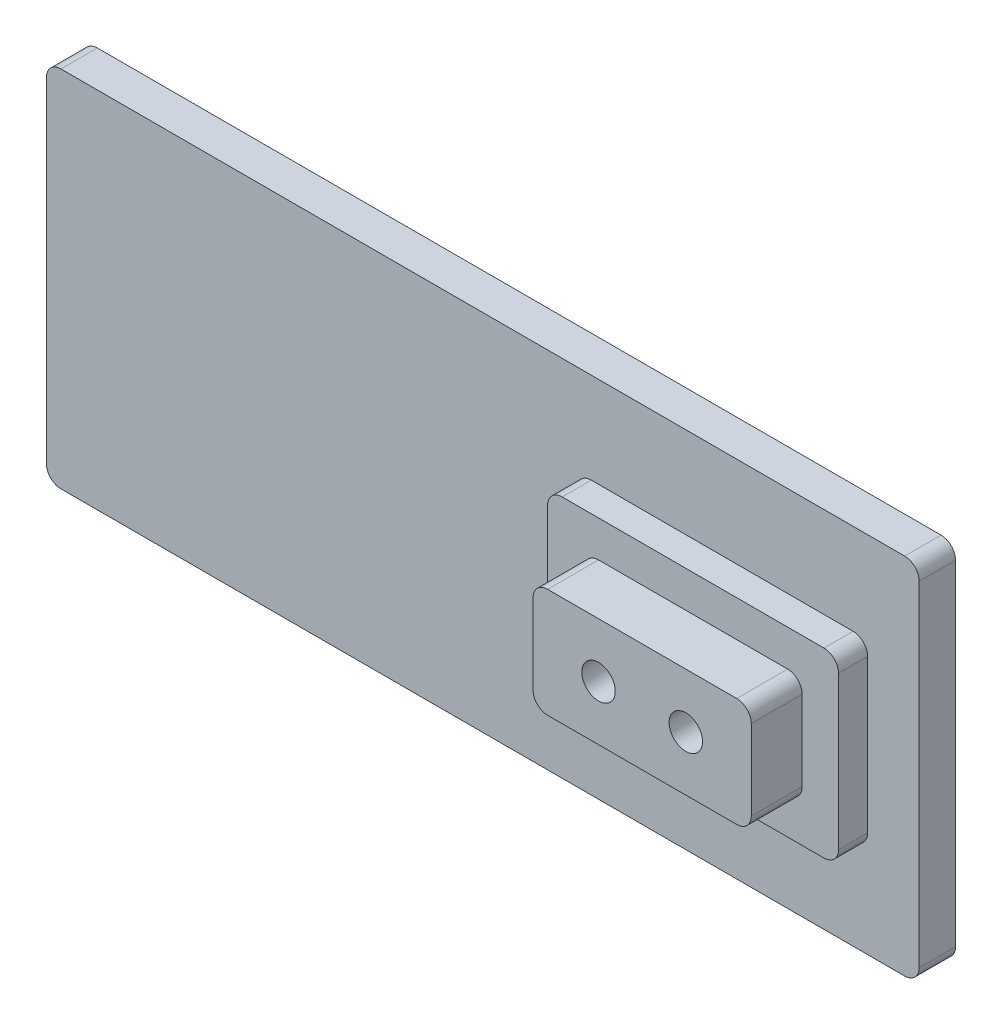
ISO-10303-21;
HEADER;
FILE_DESCRIPTION(('STEP AP214'),'2;1');
FILE_NAME('part.step','',(''),(''),'','','');
FILE_SCHEMA(('AUTOMOTIVE_DESIGN { 1 0 10303 214 1 1 1 1 }'));
ENDSEC;
DATA;
#1=APPLICATION_CONTEXT('core data for automotive mechanical design processes');
#2=APPLICATION_PROTOCOL_DEFINITION('international standard','automotive_design',2000,#1);
#3=PRODUCT_CONTEXT('',#1,'mechanical');
#4=PRODUCT('Part','Part','',(#3));
#5=PRODUCT_RELATED_PRODUCT_CATEGORY('part','',(#4));
#6=PRODUCT_DEFINITION_FORMATION('','',#4);
#7=PRODUCT_DEFINITION_CONTEXT('part definition',#1,'design');
#8=PRODUCT_DEFINITION('design','',#6,#7);
#9=PRODUCT_DEFINITION_SHAPE('','',#8);
#10=(LENGTH_UNIT() NAMED_UNIT(*) SI_UNIT(.MILLI.,.METRE.));
#11=(NAMED_UNIT(*) PLANE_ANGLE_UNIT() SI_UNIT($,.RADIAN.));
#12=(NAMED_UNIT(*) SI_UNIT($,.STERADIAN.) SOLID_ANGLE_UNIT());
#13=UNCERTAINTY_MEASURE_WITH_UNIT(LENGTH_MEASURE(1.E-05),#10,'distance_accuracy_value','');
#14=(GEOMETRIC_REPRESENTATION_CONTEXT(3) GLOBAL_UNCERTAINTY_ASSIGNED_CONTEXT((#13)) GLOBAL_UNIT_ASSIGNED_CONTEXT((#10,
#11,#12)) REPRESENTATION_CONTEXT('',''));
#15=CARTESIAN_POINT('',(0.,0.,0.));
#16=DIRECTION('',(0.,0.,1.));
#17=DIRECTION('',(1.,0.,0.));
#18=AXIS2_PLACEMENT_3D('',#15,#16,#17);
#19=CARTESIAN_POINT('',(-6.,0.,16.));
#20=DIRECTION('',(0.,0.,-1.));
#21=DIRECTION('',(-1.,0.,0.));
#22=AXIS2_PLACEMENT_3D('',#19,#20,#21);
#23=CYLINDRICAL_SURFACE('',#22,2.3);
#24=CARTESIAN_POINT('',(-6.,0.,16.));
#25=DIRECTION('',(0.,0.,1.));
#26=DIRECTION('',(-1.,0.,0.));
#27=AXIS2_PLACEMENT_3D('',#24,#25,#26);
#28=CIRCLE('',#27,2.3);
#29=CARTESIAN_POINT('',(-8.3,0.,16.));
#30=VERTEX_POINT('',#29);
#31=EDGE_CURVE('E333',#30,#30,#28,.T.);
#32=ORIENTED_EDGE('',*,*,#31,.T.);
#33=EDGE_LOOP('',(#32));
#34=FACE_BOUND('',#33,.T.);
#35=CARTESIAN_POINT('',(-6.,0.,5.));
#36=DIRECTION('',(0.,0.,-1.));
#37=DIRECTION('',(-1.,0.,0.));
#38=AXIS2_PLACEMENT_3D('',#35,#36,#37);
#39=CIRCLE('',#38,2.3);
#40=CARTESIAN_POINT('',(-8.3,0.,5.));
#41=VERTEX_POINT('',#40);
#42=EDGE_CURVE('E268',#41,#41,#39,.T.);
#43=ORIENTED_EDGE('',*,*,#42,.T.);
#44=EDGE_LOOP('',(#43));
#45=FACE_BOUND('',#44,.T.);
#46=ADVANCED_FACE('F39',(#34,#45),#23,.F.);
#47=CARTESIAN_POINT('',(6.,0.,16.));
#48=DIRECTION('',(0.,0.,-1.));
#49=DIRECTION('',(-1.,0.,0.));
#50=AXIS2_PLACEMENT_3D('',#47,#48,#49);
#51=CYLINDRICAL_SURFACE('',#50,2.3);
#52=CARTESIAN_POINT('',(6.,0.,16.));
#53=DIRECTION('',(0.,0.,1.));
#54=DIRECTION('',(1.,0.,0.));
#55=AXIS2_PLACEMENT_3D('',#52,#53,#54);
#56=CIRCLE('',#55,2.3);
#57=CARTESIAN_POINT('',(8.3,0.,16.));
#58=VERTEX_POINT('',#57);
#59=EDGE_CURVE('E320',#58,#58,#56,.T.);
#60=ORIENTED_EDGE('',*,*,#59,.T.);
#61=EDGE_LOOP('',(#60));
#62=FACE_BOUND('',#61,.T.);
#63=CARTESIAN_POINT('',(6.,0.,5.));
#64=DIRECTION('',(0.,0.,-1.));
#65=DIRECTION('',(-1.,0.,0.));
#66=AXIS2_PLACEMENT_3D('',#63,#64,#65);
#67=CIRCLE('',#66,2.3);
#68=CARTESIAN_POINT('',(3.7,0.,5.));
#69=VERTEX_POINT('',#68);
#70=EDGE_CURVE('E264',#69,#69,#67,.T.);
#71=ORIENTED_EDGE('',*,*,#70,.T.);
#72=EDGE_LOOP('',(#71));
#73=FACE_BOUND('',#72,.T.);
#74=ADVANCED_FACE('F502',(#62,#73),#51,.F.);
#75=CARTESIAN_POINT('',(15.,-7.5,16.));
#76=DIRECTION('',(-1.,0.,0.));
#77=DIRECTION('',(0.,0.,1.));
#78=AXIS2_PLACEMENT_3D('',#75,#76,#77);
#79=PLANE('',#78);
#80=DIRECTION('',(0.,1.,0.));
#81=VECTOR('',#80,1.);
#82=CARTESIAN_POINT('',(15.,-7.5,16.));
#83=LINE('',#82,#81);
#84=CARTESIAN_POINT('',(15.,-5.5,16.));
#85=VERTEX_POINT('',#84);
#86=CARTESIAN_POINT('',(15.,5.5,16.));
#87=VERTEX_POINT('',#86);
#88=EDGE_CURVE('E336',#85,#87,#83,.T.);
#89=ORIENTED_EDGE('',*,*,#88,.F.);
#90=DIRECTION('',(0.,0.,-1.));
#91=VECTOR('',#90,1.);
#92=CARTESIAN_POINT('',(15.,-5.5,16.));
#93=LINE('',#92,#91);
#94=CARTESIAN_POINT('',(15.,-5.5,9.));
#95=VERTEX_POINT('',#94);
#96=EDGE_CURVE('E352',#85,#95,#93,.T.);
#97=ORIENTED_EDGE('',*,*,#96,.T.);
#98=DIRECTION('',(0.,1.,0.));
#99=VECTOR('',#98,1.);
#100=CARTESIAN_POINT('',(15.,-7.5,9.));
#101=LINE('',#100,#99);
#102=CARTESIAN_POINT('',(15.,5.49999999999999,9.));
#103=VERTEX_POINT('',#102);
#104=EDGE_CURVE('E271',#95,#103,#101,.T.);
#105=ORIENTED_EDGE('',*,*,#104,.T.);
#106=DIRECTION('',(0.,0.,-1.));
#107=VECTOR('',#106,1.);
#108=CARTESIAN_POINT('',(15.,5.5,16.));
#109=LINE('',#108,#107);
#110=EDGE_CURVE('E348',#103,#87,#109,.F.);
#111=ORIENTED_EDGE('',*,*,#110,.T.);
#112=EDGE_LOOP('',(#89,#97,#105,#111));
#113=FACE_BOUND('',#112,.T.);
#114=ADVANCED_FACE('F508',(#113),#79,.F.);
#115=CARTESIAN_POINT('',(-15.,7.5,16.));
#116=DIRECTION('',(0.,-1.,0.));
#117=DIRECTION('',(0.,0.,-1.));
#118=AXIS2_PLACEMENT_3D('',#115,#116,#117);
#119=PLANE('',#118);
#120=DIRECTION('',(-1.,0.,0.));
#121=VECTOR('',#120,1.);
#122=CARTESIAN_POINT('',(-15.,7.5,16.));
#123=LINE('',#122,#121);
#124=CARTESIAN_POINT('',(13.,7.5,16.));
#125=VERTEX_POINT('',#124);
#126=CARTESIAN_POINT('',(-13.,7.5,16.));
#127=VERTEX_POINT('',#126);
#128=EDGE_CURVE('E339',#125,#127,#123,.T.);
#129=ORIENTED_EDGE('',*,*,#128,.F.);
#130=DIRECTION('',(0.,0.,-1.));
#131=VECTOR('',#130,1.);
#132=CARTESIAN_POINT('',(13.,7.5,16.));
#133=LINE('',#132,#131);
#134=CARTESIAN_POINT('',(13.,7.5,9.));
#135=VERTEX_POINT('',#134);
#136=EDGE_CURVE('E370',#125,#135,#133,.T.);
#137=ORIENTED_EDGE('',*,*,#136,.T.);
#138=DIRECTION('',(-1.,0.,0.));
#139=VECTOR('',#138,1.);
#140=CARTESIAN_POINT('',(-15.,7.5,9.));
#141=LINE('',#140,#139);
#142=CARTESIAN_POINT('',(-13.,7.5,9.));
#143=VERTEX_POINT('',#142);
#144=EDGE_CURVE('E274',#135,#143,#141,.T.);
#145=ORIENTED_EDGE('',*,*,#144,.T.);
#146=DIRECTION('',(0.,0.,-1.));
#147=VECTOR('',#146,1.);
#148=CARTESIAN_POINT('',(-13.,7.5,16.));
#149=LINE('',#148,#147);
#150=EDGE_CURVE('E368',#143,#127,#149,.F.);
#151=ORIENTED_EDGE('',*,*,#150,.T.);
#152=EDGE_LOOP('',(#129,#137,#145,#151));
#153=FACE_BOUND('',#152,.T.);
#154=ADVANCED_FACE('F530',(#153),#119,.F.);
#155=CARTESIAN_POINT('',(-15.,-7.5,16.));
#156=DIRECTION('',(1.,0.,0.));
#157=DIRECTION('',(0.,0.,-1.));
#158=AXIS2_PLACEMENT_3D('',#155,#156,#157);
#159=PLANE('',#158);
#160=DIRECTION('',(0.,-1.,0.));
#161=VECTOR('',#160,1.);
#162=CARTESIAN_POINT('',(-15.,-7.5,16.));
#163=LINE('',#162,#161);
#164=CARTESIAN_POINT('',(-15.,5.5,16.));
#165=VERTEX_POINT('',#164);
#166=CARTESIAN_POINT('',(-15.,-5.5,16.));
#167=VERTEX_POINT('',#166);
#168=EDGE_CURVE('E342',#165,#167,#163,.T.);
#169=ORIENTED_EDGE('',*,*,#168,.F.);
#170=DIRECTION('',(0.,0.,-1.));
#171=VECTOR('',#170,1.);
#172=CARTESIAN_POINT('',(-15.,5.5,16.));
#173=LINE('',#172,#171);
#174=CARTESIAN_POINT('',(-15.,5.49999999999999,9.));
#175=VERTEX_POINT('',#174);
#176=EDGE_CURVE('E375',#165,#175,#173,.T.);
#177=ORIENTED_EDGE('',*,*,#176,.T.);
#178=DIRECTION('',(0.,-1.,0.));
#179=VECTOR('',#178,1.);
#180=CARTESIAN_POINT('',(-15.,-7.5,9.));
#181=LINE('',#180,#179);
#182=CARTESIAN_POINT('',(-15.,-5.5,9.));
#183=VERTEX_POINT('',#182);
#184=EDGE_CURVE('E277',#175,#183,#181,.T.);
#185=ORIENTED_EDGE('',*,*,#184,.T.);
#186=DIRECTION('',(0.,0.,-1.));
#187=VECTOR('',#186,1.);
#188=CARTESIAN_POINT('',(-15.,-5.5,16.));
#189=LINE('',#188,#187);
#190=EDGE_CURVE('E373',#183,#167,#189,.F.);
#191=ORIENTED_EDGE('',*,*,#190,.T.);
#192=EDGE_LOOP('',(#169,#177,#185,#191));
#193=FACE_BOUND('',#192,.T.);
#194=ADVANCED_FACE('F526',(#193),#159,.F.);
#195=CARTESIAN_POINT('',(-15.,-7.5,16.));
#196=DIRECTION('',(0.,1.,0.));
#197=DIRECTION('',(0.,0.,1.));
#198=AXIS2_PLACEMENT_3D('',#195,#196,#197);
#199=PLANE('',#198);
#200=DIRECTION('',(1.,0.,0.));
#201=VECTOR('',#200,1.);
#202=CARTESIAN_POINT('',(-15.,-7.5,9.));
#203=LINE('',#202,#201);
#204=CARTESIAN_POINT('',(-13.,-7.5,9.));
#205=VERTEX_POINT('',#204);
#206=CARTESIAN_POINT('',(13.,-7.5,9.));
#207=VERTEX_POINT('',#206);
#208=EDGE_CURVE('E280',#205,#207,#203,.T.);
#209=ORIENTED_EDGE('',*,*,#208,.T.);
#210=DIRECTION('',(0.,0.,-1.));
#211=VECTOR('',#210,1.);
#212=CARTESIAN_POINT('',(13.,-7.5,16.));
#213=LINE('',#212,#211);
#214=CARTESIAN_POINT('',(13.,-7.5,16.));
#215=VERTEX_POINT('',#214);
#216=EDGE_CURVE('E358',#207,#215,#213,.F.);
#217=ORIENTED_EDGE('',*,*,#216,.T.);
#218=DIRECTION('',(1.,0.,0.));
#219=VECTOR('',#218,1.);
#220=CARTESIAN_POINT('',(-15.,-7.5,16.));
#221=LINE('',#220,#219);
#222=CARTESIAN_POINT('',(-13.,-7.5,16.));
#223=VERTEX_POINT('',#222);
#224=EDGE_CURVE('E345',#223,#215,#221,.T.);
#225=ORIENTED_EDGE('',*,*,#224,.F.);
#226=DIRECTION('',(0.,0.,-1.));
#227=VECTOR('',#226,1.);
#228=CARTESIAN_POINT('',(-13.,-7.5,16.));
#229=LINE('',#228,#227);
#230=EDGE_CURVE('E355',#223,#205,#229,.T.);
#231=ORIENTED_EDGE('',*,*,#230,.T.);
#232=EDGE_LOOP('',(#209,#217,#225,#231));
#233=FACE_BOUND('',#232,.T.);
#234=ADVANCED_FACE('F523',(#233),#199,.F.);
#235=CARTESIAN_POINT('',(0.,0.,5.));
#236=DIRECTION('',(0.,0.,-1.));
#237=DIRECTION('',(-1.,0.,0.));
#238=AXIS2_PLACEMENT_3D('',#235,#236,#237);
#239=PLANE('',#238);
#240=DIRECTION('',(0.,1.,0.));
#241=VECTOR('',#240,1.);
#242=CARTESIAN_POINT('',(-92.9099337965003,-25.,5.));
#243=LINE('',#242,#241);
#244=CARTESIAN_POINT('',(-92.9099337965003,-23.,5.));
#245=VERTEX_POINT('',#244);
#246=CARTESIAN_POINT('',(-92.9099337965003,23.,5.));
#247=VERTEX_POINT('',#246);
#248=EDGE_CURVE('E315',#245,#247,#243,.T.);
#249=ORIENTED_EDGE('',*,*,#248,.F.);
#250=CARTESIAN_POINT('',(-90.9099337965003,-23.,5.));
#251=DIRECTION('',(0.,0.,-1.));
#252=DIRECTION('',(-1.,0.,0.));
#253=AXIS2_PLACEMENT_3D('',#250,#251,#252);
#254=CIRCLE('',#253,2.);
#255=CARTESIAN_POINT('',(-90.9099337965003,-25.,5.));
#256=VERTEX_POINT('',#255);
#257=EDGE_CURVE('E429',#245,#256,#254,.F.);
#258=ORIENTED_EDGE('',*,*,#257,.T.);
#259=DIRECTION('',(-1.,0.,0.));
#260=VECTOR('',#259,1.);
#261=CARTESIAN_POINT('',(27.0900662034997,-25.,5.));
#262=LINE('',#261,#260);
#263=CARTESIAN_POINT('',(25.0900662034997,-25.,5.));
#264=VERTEX_POINT('',#263);
#265=EDGE_CURVE('E311',#264,#256,#262,.T.);
#266=ORIENTED_EDGE('',*,*,#265,.F.);
#267=CARTESIAN_POINT('',(25.0900662034997,-23.,5.));
#268=DIRECTION('',(0.,0.,-1.));
#269=DIRECTION('',(-1.,0.,0.));
#270=AXIS2_PLACEMENT_3D('',#267,#268,#269);
#271=CIRCLE('',#270,2.);
#272=CARTESIAN_POINT('',(27.0900662034997,-23.,5.));
#273=VERTEX_POINT('',#272);
#274=EDGE_CURVE('E425',#264,#273,#271,.F.);
#275=ORIENTED_EDGE('',*,*,#274,.T.);
#276=DIRECTION('',(0.,-1.,0.));
#277=VECTOR('',#276,1.);
#278=CARTESIAN_POINT('',(27.0900662034997,25.,5.));
#279=LINE('',#278,#277);
#280=CARTESIAN_POINT('',(27.0900662034997,23.,5.));
#281=VERTEX_POINT('',#280);
#282=EDGE_CURVE('E308',#281,#273,#279,.T.);
#283=ORIENTED_EDGE('',*,*,#282,.F.);
#284=CARTESIAN_POINT('',(25.0900662034997,23.,5.));
#285=DIRECTION('',(0.,0.,-1.));
#286=DIRECTION('',(-1.,0.,0.));
#287=AXIS2_PLACEMENT_3D('',#284,#285,#286);
#288=CIRCLE('',#287,2.);
#289=CARTESIAN_POINT('',(25.0900662034997,25.,5.));
#290=VERTEX_POINT('',#289);
#291=EDGE_CURVE('E54',#281,#290,#288,.F.);
#292=ORIENTED_EDGE('',*,*,#291,.T.);
#293=DIRECTION('',(1.,0.,0.));
#294=VECTOR('',#293,1.);
#295=CARTESIAN_POINT('',(27.0900662034997,25.,5.));
#296=LINE('',#295,#294);
#297=CARTESIAN_POINT('',(-90.9099337965003,25.,5.));
#298=VERTEX_POINT('',#297);
#299=EDGE_CURVE('E318',#298,#290,#296,.T.);
#300=ORIENTED_EDGE('',*,*,#299,.F.);
#301=CARTESIAN_POINT('',(-90.9099337965003,23.,5.));
#302=DIRECTION('',(0.,0.,-1.));
#303=DIRECTION('',(-1.,0.,0.));
#304=AXIS2_PLACEMENT_3D('',#301,#302,#303);
#305=CIRCLE('',#304,2.);
#306=EDGE_CURVE('E427',#298,#247,#305,.F.);
#307=ORIENTED_EDGE('',*,*,#306,.T.);
#308=EDGE_LOOP('',(#249,#258,#266,#275,#283,#292,#300,#307));
#309=FACE_BOUND('',#308,.T.);
#310=DIRECTION('',(0.,1.,0.));
#311=VECTOR('',#310,1.);
#312=CARTESIAN_POINT('',(20.,-12.5,5.));
#313=LINE('',#312,#311);
#314=CARTESIAN_POINT('',(20.,-10.5,5.));
#315=VERTEX_POINT('',#314);
#316=CARTESIAN_POINT('',(20.,10.5,5.));
#317=VERTEX_POINT('',#316);
#318=EDGE_CURVE('E283',#315,#317,#313,.T.);
#319=ORIENTED_EDGE('',*,*,#318,.F.);
#320=CARTESIAN_POINT('',(18.,-10.5,5.));
#321=DIRECTION('',(0.,0.,-1.));
#322=DIRECTION('',(-1.,0.,0.));
#323=AXIS2_PLACEMENT_3D('',#320,#321,#322);
#324=CIRCLE('',#323,2.);
#325=CARTESIAN_POINT('',(18.,-12.5,5.));
#326=VERTEX_POINT('',#325);
#327=EDGE_CURVE('E450',#315,#326,#324,.T.);
#328=ORIENTED_EDGE('',*,*,#327,.T.);
#329=DIRECTION('',(1.,0.,0.));
#330=VECTOR('',#329,1.);
#331=CARTESIAN_POINT('',(-20.,-12.5,5.));
#332=LINE('',#331,#330);
#333=CARTESIAN_POINT('',(-18.,-12.5,5.));
#334=VERTEX_POINT('',#333);
#335=EDGE_CURVE('E288',#334,#326,#332,.T.);
#336=ORIENTED_EDGE('',*,*,#335,.F.);
#337=CARTESIAN_POINT('',(-18.,-10.5,5.));
#338=DIRECTION('',(0.,0.,-1.));
#339=DIRECTION('',(-1.,0.,0.));
#340=AXIS2_PLACEMENT_3D('',#337,#338,#339);
#341=CIRCLE('',#340,2.);
#342=CARTESIAN_POINT('',(-20.,-10.5,5.));
#343=VERTEX_POINT('',#342);
#344=EDGE_CURVE('E448',#334,#343,#341,.T.);
#345=ORIENTED_EDGE('',*,*,#344,.T.);
#346=DIRECTION('',(0.,-1.,0.));
#347=VECTOR('',#346,1.);
#348=CARTESIAN_POINT('',(-20.,-12.5,5.));
#349=LINE('',#348,#347);
#350=CARTESIAN_POINT('',(-20.,10.5,5.));
#351=VERTEX_POINT('',#350);
#352=EDGE_CURVE('E303',#351,#343,#349,.T.);
#353=ORIENTED_EDGE('',*,*,#352,.F.);
#354=CARTESIAN_POINT('',(-18.,10.5,5.));
#355=DIRECTION('',(0.,0.,-1.));
#356=DIRECTION('',(-1.,0.,0.));
#357=AXIS2_PLACEMENT_3D('',#354,#355,#356);
#358=CIRCLE('',#357,2.);
#359=CARTESIAN_POINT('',(-18.,12.5,5.));
#360=VERTEX_POINT('',#359);
#361=EDGE_CURVE('E11',#351,#360,#358,.T.);
#362=ORIENTED_EDGE('',*,*,#361,.T.);
#363=DIRECTION('',(-1.,0.,0.));
#364=VECTOR('',#363,1.);
#365=CARTESIAN_POINT('',(-20.,12.5,5.));
#366=LINE('',#365,#364);
#367=CARTESIAN_POINT('',(18.,12.5,5.));
#368=VERTEX_POINT('',#367);
#369=EDGE_CURVE('E300',#368,#360,#366,.T.);
#370=ORIENTED_EDGE('',*,*,#369,.F.);
#371=CARTESIAN_POINT('',(18.,10.5,5.));
#372=DIRECTION('',(0.,0.,-1.));
#373=DIRECTION('',(-1.,0.,0.));
#374=AXIS2_PLACEMENT_3D('',#371,#372,#373);
#375=CIRCLE('',#374,2.);
#376=EDGE_CURVE('E47',#368,#317,#375,.T.);
#377=ORIENTED_EDGE('',*,*,#376,.T.);
#378=EDGE_LOOP('',(#319,#328,#336,#345,#353,#362,#370,#377));
#379=FACE_BOUND('',#378,.T.);
#380=ADVANCED_FACE('F454',(#309,#379),#239,.F.);
#381=CARTESIAN_POINT('',(0.,0.,16.));
#382=DIRECTION('',(0.,0.,-1.));
#383=DIRECTION('',(-1.,0.,0.));
#384=AXIS2_PLACEMENT_3D('',#381,#382,#383);
#385=PLANE('',#384);
#386=ORIENTED_EDGE('',*,*,#224,.T.);
#387=CARTESIAN_POINT('',(13.,-5.5,16.));
#388=DIRECTION('',(0.,0.,-1.));
#389=DIRECTION('',(-1.,0.,0.));
#390=AXIS2_PLACEMENT_3D('',#387,#388,#389);
#391=CIRCLE('',#390,2.);
#392=EDGE_CURVE('E366',#215,#85,#391,.F.);
#393=ORIENTED_EDGE('',*,*,#392,.T.);
#394=ORIENTED_EDGE('',*,*,#88,.T.);
#395=CARTESIAN_POINT('',(13.,5.5,16.));
#396=DIRECTION('',(0.,0.,-1.));
#397=DIRECTION('',(-1.,0.,0.));
#398=AXIS2_PLACEMENT_3D('',#395,#396,#397);
#399=CIRCLE('',#398,2.);
#400=EDGE_CURVE('E364',#87,#125,#399,.F.);
#401=ORIENTED_EDGE('',*,*,#400,.T.);
#402=ORIENTED_EDGE('',*,*,#128,.T.);
#403=CARTESIAN_POINT('',(-13.,5.5,16.));
#404=DIRECTION('',(0.,0.,-1.));
#405=DIRECTION('',(-1.,0.,0.));
#406=AXIS2_PLACEMENT_3D('',#403,#404,#405);
#407=CIRCLE('',#406,2.);
#408=EDGE_CURVE('E362',#127,#165,#407,.F.);
#409=ORIENTED_EDGE('',*,*,#408,.T.);
#410=ORIENTED_EDGE('',*,*,#168,.T.);
#411=CARTESIAN_POINT('',(-13.,-5.5,16.));
#412=DIRECTION('',(0.,0.,-1.));
#413=DIRECTION('',(-1.,0.,0.));
#414=AXIS2_PLACEMENT_3D('',#411,#412,#413);
#415=CIRCLE('',#414,2.);
#416=EDGE_CURVE('E360',#167,#223,#415,.F.);
#417=ORIENTED_EDGE('',*,*,#416,.T.);
#418=EDGE_LOOP('',(#386,#393,#394,#401,#402,#409,#410,#417));
#419=FACE_BOUND('',#418,.T.);
#420=ORIENTED_EDGE('',*,*,#31,.F.);
#421=EDGE_LOOP('',(#420));
#422=FACE_BOUND('',#421,.T.);
#423=ORIENTED_EDGE('',*,*,#59,.F.);
#424=EDGE_LOOP('',(#423));
#425=FACE_BOUND('',#424,.T.);
#426=ADVANCED_FACE('F514',(#419,#422,#425),#385,.F.);
#427=CARTESIAN_POINT('',(0.,0.,0.));
#428=DIRECTION('',(0.,0.,-1.));
#429=DIRECTION('',(-1.,0.,0.));
#430=AXIS2_PLACEMENT_3D('',#427,#428,#429);
#431=PLANE('',#430);
#432=CARTESIAN_POINT('',(-6.,0.,0.));
#433=DIRECTION('',(0.,0.,-1.));
#434=DIRECTION('',(-1.,0.,0.));
#435=AXIS2_PLACEMENT_3D('',#432,#433,#434);
#436=CIRCLE('',#435,7.5);
#437=CARTESIAN_POINT('',(-6.,-7.5,0.));
#438=VERTEX_POINT('',#437);
#439=CARTESIAN_POINT('',(-6.,7.5,0.));
#440=VERTEX_POINT('',#439);
#441=EDGE_CURVE('E232',#438,#440,#436,.T.);
#442=ORIENTED_EDGE('',*,*,#441,.F.);
#443=DIRECTION('',(-1.,0.,0.));
#444=VECTOR('',#443,1.);
#445=CARTESIAN_POINT('',(-6.,-7.5,0.));
#446=LINE('',#445,#444);
#447=CARTESIAN_POINT('',(6.,-7.5,0.));
#448=VERTEX_POINT('',#447);
#449=EDGE_CURVE('E249',#448,#438,#446,.T.);
#450=ORIENTED_EDGE('',*,*,#449,.F.);
#451=CARTESIAN_POINT('',(6.,0.,0.));
#452=DIRECTION('',(0.,0.,-1.));
#453=DIRECTION('',(-1.,0.,0.));
#454=AXIS2_PLACEMENT_3D('',#451,#452,#453);
#455=CIRCLE('',#454,7.5);
#456=CARTESIAN_POINT('',(6.,7.5,0.));
#457=VERTEX_POINT('',#456);
#458=EDGE_CURVE('E252',#457,#448,#455,.T.);
#459=ORIENTED_EDGE('',*,*,#458,.F.);
#460=DIRECTION('',(1.,0.,0.));
#461=VECTOR('',#460,1.);
#462=CARTESIAN_POINT('',(-6.,7.5,0.));
#463=LINE('',#462,#461);
#464=EDGE_CURVE('E258',#440,#457,#463,.T.);
#465=ORIENTED_EDGE('',*,*,#464,.F.);
#466=EDGE_LOOP('',(#442,#450,#459,#465));
#467=FACE_BOUND('',#466,.T.);
#468=DIRECTION('',(-1.,0.,0.));
#469=VECTOR('',#468,1.);
#470=CARTESIAN_POINT('',(27.0900662034997,-25.,0.));
#471=LINE('',#470,#469);
#472=CARTESIAN_POINT('',(25.0900662034997,-25.,0.));
#473=VERTEX_POINT('',#472);
#474=CARTESIAN_POINT('',(-90.9099337965003,-25.,0.));
#475=VERTEX_POINT('',#474);
#476=EDGE_CURVE('E323',#473,#475,#471,.T.);
#477=ORIENTED_EDGE('',*,*,#476,.T.);
#478=CARTESIAN_POINT('',(-90.9099337965003,-23.,0.));
#479=DIRECTION('',(0.,0.,-1.));
#480=DIRECTION('',(-1.,0.,0.));
#481=AXIS2_PLACEMENT_3D('',#478,#479,#480);
#482=CIRCLE('',#481,2.);
#483=CARTESIAN_POINT('',(-92.9099337965003,-23.,0.));
#484=VERTEX_POINT('',#483);
#485=EDGE_CURVE('E417',#475,#484,#482,.T.);
#486=ORIENTED_EDGE('',*,*,#485,.T.);
#487=DIRECTION('',(0.,1.,0.));
#488=VECTOR('',#487,1.);
#489=CARTESIAN_POINT('',(-92.9099337965003,-25.,0.));
#490=LINE('',#489,#488);
#491=CARTESIAN_POINT('',(-92.9099337965003,23.,0.));
#492=VERTEX_POINT('',#491);
#493=EDGE_CURVE('E326',#484,#492,#490,.T.);
#494=ORIENTED_EDGE('',*,*,#493,.T.);
#495=CARTESIAN_POINT('',(-90.9099337965003,23.,0.));
#496=DIRECTION('',(0.,0.,-1.));
#497=DIRECTION('',(-1.,0.,0.));
#498=AXIS2_PLACEMENT_3D('',#495,#496,#497);
#499=CIRCLE('',#498,2.);
#500=CARTESIAN_POINT('',(-90.9099337965003,25.,0.));
#501=VERTEX_POINT('',#500);
#502=EDGE_CURVE('E415',#492,#501,#499,.T.);
#503=ORIENTED_EDGE('',*,*,#502,.T.);
#504=DIRECTION('',(1.,0.,0.));
#505=VECTOR('',#504,1.);
#506=CARTESIAN_POINT('',(27.0900662034997,25.,0.));
#507=LINE('',#506,#505);
#508=CARTESIAN_POINT('',(25.0900662034997,25.,0.));
#509=VERTEX_POINT('',#508);
#510=EDGE_CURVE('E312',#501,#509,#507,.T.);
#511=ORIENTED_EDGE('',*,*,#510,.T.);
#512=CARTESIAN_POINT('',(25.0900662034997,23.,0.));
#513=DIRECTION('',(0.,0.,-1.));
#514=DIRECTION('',(-1.,0.,0.));
#515=AXIS2_PLACEMENT_3D('',#512,#513,#514);
#516=CIRCLE('',#515,2.);
#517=CARTESIAN_POINT('',(27.0900662034997,23.,0.));
#518=VERTEX_POINT('',#517);
#519=EDGE_CURVE('E411',#509,#518,#516,.T.);
#520=ORIENTED_EDGE('',*,*,#519,.T.);
#521=DIRECTION('',(0.,-1.,0.));
#522=VECTOR('',#521,1.);
#523=CARTESIAN_POINT('',(27.0900662034997,25.,0.));
#524=LINE('',#523,#522);
#525=CARTESIAN_POINT('',(27.0900662034997,-23.,0.));
#526=VERTEX_POINT('',#525);
#527=EDGE_CURVE('E297',#518,#526,#524,.T.);
#528=ORIENTED_EDGE('',*,*,#527,.T.);
#529=CARTESIAN_POINT('',(25.0900662034997,-23.,0.));
#530=DIRECTION('',(0.,0.,-1.));
#531=DIRECTION('',(-1.,0.,0.));
#532=AXIS2_PLACEMENT_3D('',#529,#530,#531);
#533=CIRCLE('',#532,2.);
#534=EDGE_CURVE('E413',#526,#473,#533,.T.);
#535=ORIENTED_EDGE('',*,*,#534,.T.);
#536=EDGE_LOOP('',(#477,#486,#494,#503,#511,#520,#528,#535));
#537=FACE_BOUND('',#536,.T.);
#538=ADVANCED_FACE('F517',(#467,#537),#431,.T.);
#539=CARTESIAN_POINT('',(27.0900662034997,25.,5.));
#540=DIRECTION('',(1.,0.,0.));
#541=DIRECTION('',(0.,1.,0.));
#542=AXIS2_PLACEMENT_3D('',#539,#540,#541);
#543=PLANE('',#542);
#544=ORIENTED_EDGE('',*,*,#282,.T.);
#545=DIRECTION('',(0.,0.,-1.));
#546=VECTOR('',#545,1.);
#547=CARTESIAN_POINT('',(27.0900662034997,-23.,5.));
#548=LINE('',#547,#546);
#549=EDGE_CURVE('E437',#273,#526,#548,.T.);
#550=ORIENTED_EDGE('',*,*,#549,.T.);
#551=ORIENTED_EDGE('',*,*,#527,.F.);
#552=DIRECTION('',(0.,0.,-1.));
#553=VECTOR('',#552,1.);
#554=CARTESIAN_POINT('',(27.0900662034997,23.,5.));
#555=LINE('',#554,#553);
#556=EDGE_CURVE('E435',#518,#281,#555,.F.);
#557=ORIENTED_EDGE('',*,*,#556,.T.);
#558=EDGE_LOOP('',(#544,#550,#551,#557));
#559=FACE_BOUND('',#558,.T.);
#560=ADVANCED_FACE('F521',(#559),#543,.T.);
#561=CARTESIAN_POINT('',(27.0900662034997,25.,5.));
#562=DIRECTION('',(0.,1.,0.));
#563=DIRECTION('',(-1.,0.,0.));
#564=AXIS2_PLACEMENT_3D('',#561,#562,#563);
#565=PLANE('',#564);
#566=ORIENTED_EDGE('',*,*,#510,.F.);
#567=DIRECTION('',(0.,0.,-1.));
#568=VECTOR('',#567,1.);
#569=CARTESIAN_POINT('',(-90.9099337965003,25.,5.));
#570=LINE('',#569,#568);
#571=EDGE_CURVE('E61',#501,#298,#570,.F.);
#572=ORIENTED_EDGE('',*,*,#571,.T.);
#573=ORIENTED_EDGE('',*,*,#299,.T.);
#574=DIRECTION('',(0.,0.,-1.));
#575=VECTOR('',#574,1.);
#576=CARTESIAN_POINT('',(25.0900662034997,25.,5.));
#577=LINE('',#576,#575);
#578=EDGE_CURVE('E431',#290,#509,#577,.T.);
#579=ORIENTED_EDGE('',*,*,#578,.T.);
#580=EDGE_LOOP('',(#566,#572,#573,#579));
#581=FACE_BOUND('',#580,.T.);
#582=ADVANCED_FACE('F597',(#581),#565,.T.);
#583=CARTESIAN_POINT('',(-92.9099337965003,-25.,5.));
#584=DIRECTION('',(-1.,0.,0.));
#585=DIRECTION('',(0.,0.,1.));
#586=AXIS2_PLACEMENT_3D('',#583,#584,#585);
#587=PLANE('',#586);
#588=ORIENTED_EDGE('',*,*,#493,.F.);
#589=DIRECTION('',(0.,0.,-1.));
#590=VECTOR('',#589,1.);
#591=CARTESIAN_POINT('',(-92.9099337965003,-23.,5.));
#592=LINE('',#591,#590);
#593=EDGE_CURVE('E422',#484,#245,#592,.F.);
#594=ORIENTED_EDGE('',*,*,#593,.T.);
#595=ORIENTED_EDGE('',*,*,#248,.T.);
#596=DIRECTION('',(0.,0.,-1.));
#597=VECTOR('',#596,1.);
#598=CARTESIAN_POINT('',(-92.9099337965003,23.,5.));
#599=LINE('',#598,#597);
#600=EDGE_CURVE('E419',#247,#492,#599,.T.);
#601=ORIENTED_EDGE('',*,*,#600,.T.);
#602=EDGE_LOOP('',(#588,#594,#595,#601));
#603=FACE_BOUND('',#602,.T.);
#604=ADVANCED_FACE('F583',(#603),#587,.T.);
#605=CARTESIAN_POINT('',(27.0900662034997,-25.,5.));
#606=DIRECTION('',(0.,-1.,0.));
#607=DIRECTION('',(0.,0.,-1.));
#608=AXIS2_PLACEMENT_3D('',#605,#606,#607);
#609=PLANE('',#608);
#610=ORIENTED_EDGE('',*,*,#265,.T.);
#611=DIRECTION('',(0.,0.,-1.));
#612=VECTOR('',#611,1.);
#613=CARTESIAN_POINT('',(-90.9099337965003,-25.,5.));
#614=LINE('',#613,#612);
#615=EDGE_CURVE('E408',#256,#475,#614,.T.);
#616=ORIENTED_EDGE('',*,*,#615,.T.);
#617=ORIENTED_EDGE('',*,*,#476,.F.);
#618=DIRECTION('',(0.,0.,-1.));
#619=VECTOR('',#618,1.);
#620=CARTESIAN_POINT('',(25.0900662034997,-25.,5.));
#621=LINE('',#620,#619);
#622=EDGE_CURVE('E406',#473,#264,#621,.F.);
#623=ORIENTED_EDGE('',*,*,#622,.T.);
#624=EDGE_LOOP('',(#610,#616,#617,#623));
#625=FACE_BOUND('',#624,.T.);
#626=ADVANCED_FACE('F576',(#625),#609,.T.);
#627=CARTESIAN_POINT('',(0.,0.,9.));
#628=DIRECTION('',(0.,0.,-1.));
#629=DIRECTION('',(-1.,0.,0.));
#630=AXIS2_PLACEMENT_3D('',#627,#628,#629);
#631=PLANE('',#630);
#632=DIRECTION('',(0.,-1.,0.));
#633=VECTOR('',#632,1.);
#634=CARTESIAN_POINT('',(-20.,-12.5,9.));
#635=LINE('',#634,#633);
#636=CARTESIAN_POINT('',(-20.,10.5,9.));
#637=VERTEX_POINT('',#636);
#638=CARTESIAN_POINT('',(-20.,-10.5,9.));
#639=VERTEX_POINT('',#638);
#640=EDGE_CURVE('E291',#637,#639,#635,.T.);
#641=ORIENTED_EDGE('',*,*,#640,.T.);
#642=CARTESIAN_POINT('',(-18.,-10.5,9.));
#643=DIRECTION('',(0.,0.,-1.));
#644=DIRECTION('',(-1.,0.,0.));
#645=AXIS2_PLACEMENT_3D('',#642,#643,#644);
#646=CIRCLE('',#645,2.);
#647=CARTESIAN_POINT('',(-18.,-12.5,9.));
#648=VERTEX_POINT('',#647);
#649=EDGE_CURVE('E394',#639,#648,#646,.F.);
#650=ORIENTED_EDGE('',*,*,#649,.T.);
#651=DIRECTION('',(1.,0.,0.));
#652=VECTOR('',#651,1.);
#653=CARTESIAN_POINT('',(-20.,-12.5,9.));
#654=LINE('',#653,#652);
#655=CARTESIAN_POINT('',(18.,-12.5,9.));
#656=VERTEX_POINT('',#655);
#657=EDGE_CURVE('E294',#648,#656,#654,.T.);
#658=ORIENTED_EDGE('',*,*,#657,.T.);
#659=CARTESIAN_POINT('',(18.,-10.5,9.));
#660=DIRECTION('',(0.,0.,-1.));
#661=DIRECTION('',(-1.,0.,0.));
#662=AXIS2_PLACEMENT_3D('',#659,#660,#661);
#663=CIRCLE('',#662,2.);
#664=CARTESIAN_POINT('',(20.,-10.5,9.));
#665=VERTEX_POINT('',#664);
#666=EDGE_CURVE('E392',#656,#665,#663,.F.);
#667=ORIENTED_EDGE('',*,*,#666,.T.);
#668=DIRECTION('',(0.,1.,0.));
#669=VECTOR('',#668,1.);
#670=CARTESIAN_POINT('',(20.,-12.5,9.));
#671=LINE('',#670,#669);
#672=CARTESIAN_POINT('',(20.,10.5,9.));
#673=VERTEX_POINT('',#672);
#674=EDGE_CURVE('E284',#665,#673,#671,.T.);
#675=ORIENTED_EDGE('',*,*,#674,.T.);
#676=CARTESIAN_POINT('',(18.,10.5,9.));
#677=DIRECTION('',(0.,0.,-1.));
#678=DIRECTION('',(-1.,0.,0.));
#679=AXIS2_PLACEMENT_3D('',#676,#677,#678);
#680=CIRCLE('',#679,2.);
#681=CARTESIAN_POINT('',(18.,12.5,9.));
#682=VERTEX_POINT('',#681);
#683=EDGE_CURVE('E390',#673,#682,#680,.F.);
#684=ORIENTED_EDGE('',*,*,#683,.T.);
#685=DIRECTION('',(-1.,0.,0.));
#686=VECTOR('',#685,1.);
#687=CARTESIAN_POINT('',(-20.,12.5,9.));
#688=LINE('',#687,#686);
#689=CARTESIAN_POINT('',(-18.,12.5,9.));
#690=VERTEX_POINT('',#689);
#691=EDGE_CURVE('E287',#682,#690,#688,.T.);
#692=ORIENTED_EDGE('',*,*,#691,.T.);
#693=CARTESIAN_POINT('',(-18.,10.5,9.));
#694=DIRECTION('',(0.,0.,-1.));
#695=DIRECTION('',(-1.,0.,0.));
#696=AXIS2_PLACEMENT_3D('',#693,#694,#695);
#697=CIRCLE('',#696,2.);
#698=EDGE_CURVE('E388',#690,#637,#697,.F.);
#699=ORIENTED_EDGE('',*,*,#698,.T.);
#700=EDGE_LOOP('',(#641,#650,#658,#667,#675,#684,#692,#699));
#701=FACE_BOUND('',#700,.T.);
#702=ORIENTED_EDGE('',*,*,#104,.F.);
#703=CARTESIAN_POINT('',(13.,-5.5,9.));
#704=DIRECTION('',(0.,0.,-1.));
#705=DIRECTION('',(-1.,0.,0.));
#706=AXIS2_PLACEMENT_3D('',#703,#704,#705);
#707=CIRCLE('',#706,2.);
#708=EDGE_CURVE('E440',#95,#207,#707,.T.);
#709=ORIENTED_EDGE('',*,*,#708,.T.);
#710=ORIENTED_EDGE('',*,*,#208,.F.);
#711=CARTESIAN_POINT('',(-13.,-5.5,9.));
#712=DIRECTION('',(0.,0.,-1.));
#713=DIRECTION('',(-1.,0.,0.));
#714=AXIS2_PLACEMENT_3D('',#711,#712,#713);
#715=CIRCLE('',#714,2.);
#716=EDGE_CURVE('E446',#205,#183,#715,.T.);
#717=ORIENTED_EDGE('',*,*,#716,.T.);
#718=ORIENTED_EDGE('',*,*,#184,.F.);
#719=CARTESIAN_POINT('',(-13.,5.5,9.));
#720=DIRECTION('',(0.,0.,-1.));
#721=DIRECTION('',(-1.,0.,0.));
#722=AXIS2_PLACEMENT_3D('',#719,#720,#721);
#723=CIRCLE('',#722,2.);
#724=EDGE_CURVE('E444',#175,#143,#723,.T.);
#725=ORIENTED_EDGE('',*,*,#724,.T.);
#726=ORIENTED_EDGE('',*,*,#144,.F.);
#727=CARTESIAN_POINT('',(13.,5.5,9.));
#728=DIRECTION('',(0.,0.,-1.));
#729=DIRECTION('',(-1.,0.,0.));
#730=AXIS2_PLACEMENT_3D('',#727,#728,#729);
#731=CIRCLE('',#730,2.);
#732=EDGE_CURVE('E442',#135,#103,#731,.T.);
#733=ORIENTED_EDGE('',*,*,#732,.T.);
#734=EDGE_LOOP('',(#702,#709,#710,#717,#718,#725,#726,#733));
#735=FACE_BOUND('',#734,.T.);
#736=ADVANCED_FACE('F466',(#701,#735),#631,.F.);
#737=CARTESIAN_POINT('',(20.,-12.5,9.));
#738=DIRECTION('',(-1.,0.,0.));
#739=DIRECTION('',(0.,0.,1.));
#740=AXIS2_PLACEMENT_3D('',#737,#738,#739);
#741=PLANE('',#740);
#742=ORIENTED_EDGE('',*,*,#674,.F.);
#743=DIRECTION('',(0.,0.,-1.));
#744=VECTOR('',#743,1.);
#745=CARTESIAN_POINT('',(20.,-10.5,9.));
#746=LINE('',#745,#744);
#747=EDGE_CURVE('E398',#665,#315,#746,.T.);
#748=ORIENTED_EDGE('',*,*,#747,.T.);
#749=ORIENTED_EDGE('',*,*,#318,.T.);
#750=DIRECTION('',(0.,0.,-1.));
#751=VECTOR('',#750,1.);
#752=CARTESIAN_POINT('',(20.,10.5,9.));
#753=LINE('',#752,#751);
#754=EDGE_CURVE('E396',#317,#673,#753,.F.);
#755=ORIENTED_EDGE('',*,*,#754,.T.);
#756=EDGE_LOOP('',(#742,#748,#749,#755));
#757=FACE_BOUND('',#756,.T.);
#758=ADVANCED_FACE('F460',(#757),#741,.F.);
#759=CARTESIAN_POINT('',(-20.,12.5,9.));
#760=DIRECTION('',(0.,-1.,0.));
#761=DIRECTION('',(0.,0.,-1.));
#762=AXIS2_PLACEMENT_3D('',#759,#760,#761);
#763=PLANE('',#762);
#764=ORIENTED_EDGE('',*,*,#691,.F.);
#765=DIRECTION('',(0.,0.,-1.));
#766=VECTOR('',#765,1.);
#767=CARTESIAN_POINT('',(18.,12.5,9.));
#768=LINE('',#767,#766);
#769=EDGE_CURVE('E403',#682,#368,#768,.T.);
#770=ORIENTED_EDGE('',*,*,#769,.T.);
#771=ORIENTED_EDGE('',*,*,#369,.T.);
#772=DIRECTION('',(0.,0.,-1.));
#773=VECTOR('',#772,1.);
#774=CARTESIAN_POINT('',(-18.,12.5,9.));
#775=LINE('',#774,#773);
#776=EDGE_CURVE('E401',#360,#690,#775,.F.);
#777=ORIENTED_EDGE('',*,*,#776,.T.);
#778=EDGE_LOOP('',(#764,#770,#771,#777));
#779=FACE_BOUND('',#778,.T.);
#780=ADVANCED_FACE('F470',(#779),#763,.F.);
#781=CARTESIAN_POINT('',(-20.,-12.5,9.));
#782=DIRECTION('',(1.,0.,0.));
#783=DIRECTION('',(0.,0.,-1.));
#784=AXIS2_PLACEMENT_3D('',#781,#782,#783);
#785=PLANE('',#784);
#786=ORIENTED_EDGE('',*,*,#352,.T.);
#787=DIRECTION('',(0.,0.,-1.));
#788=VECTOR('',#787,1.);
#789=CARTESIAN_POINT('',(-20.,-10.5,9.));
#790=LINE('',#789,#788);
#791=EDGE_CURVE('E386',#343,#639,#790,.F.);
#792=ORIENTED_EDGE('',*,*,#791,.T.);
#793=ORIENTED_EDGE('',*,*,#640,.F.);
#794=DIRECTION('',(0.,0.,-1.));
#795=VECTOR('',#794,1.);
#796=CARTESIAN_POINT('',(-20.,10.5,9.));
#797=LINE('',#796,#795);
#798=EDGE_CURVE('E383',#637,#351,#797,.T.);
#799=ORIENTED_EDGE('',*,*,#798,.T.);
#800=EDGE_LOOP('',(#786,#792,#793,#799));
#801=FACE_BOUND('',#800,.T.);
#802=ADVANCED_FACE('F478',(#801),#785,.F.);
#803=CARTESIAN_POINT('',(-20.,-12.5,9.));
#804=DIRECTION('',(0.,1.,0.));
#805=DIRECTION('',(0.,0.,1.));
#806=AXIS2_PLACEMENT_3D('',#803,#804,#805);
#807=PLANE('',#806);
#808=ORIENTED_EDGE('',*,*,#657,.F.);
#809=DIRECTION('',(0.,0.,-1.));
#810=VECTOR('',#809,1.);
#811=CARTESIAN_POINT('',(-18.,-12.5,9.));
#812=LINE('',#811,#810);
#813=EDGE_CURVE('E380',#648,#334,#812,.T.);
#814=ORIENTED_EDGE('',*,*,#813,.T.);
#815=ORIENTED_EDGE('',*,*,#335,.T.);
#816=DIRECTION('',(0.,0.,-1.));
#817=VECTOR('',#816,1.);
#818=CARTESIAN_POINT('',(18.,-12.5,9.));
#819=LINE('',#818,#817);
#820=EDGE_CURVE('E378',#326,#656,#819,.F.);
#821=ORIENTED_EDGE('',*,*,#820,.T.);
#822=EDGE_LOOP('',(#808,#814,#815,#821));
#823=FACE_BOUND('',#822,.T.);
#824=ADVANCED_FACE('F487',(#823),#807,.F.);
#825=CARTESIAN_POINT('',(-6.,0.,5.));
#826=DIRECTION('',(0.,0.,-1.));
#827=DIRECTION('',(-1.,0.,0.));
#828=AXIS2_PLACEMENT_3D('',#825,#826,#827);
#829=CYLINDRICAL_SURFACE('',#828,7.5);
#830=ORIENTED_EDGE('',*,*,#441,.T.);
#831=DIRECTION('',(0.,0.,-1.));
#832=VECTOR('',#831,1.);
#833=CARTESIAN_POINT('',(-6.,7.5,5.));
#834=LINE('',#833,#832);
#835=CARTESIAN_POINT('',(-6.,7.5,5.));
#836=VERTEX_POINT('',#835);
#837=EDGE_CURVE('E225',#836,#440,#834,.T.);
#838=ORIENTED_EDGE('',*,*,#837,.F.);
#839=CARTESIAN_POINT('',(-6.,0.,5.));
#840=DIRECTION('',(0.,0.,-1.));
#841=DIRECTION('',(-1.,0.,0.));
#842=AXIS2_PLACEMENT_3D('',#839,#840,#841);
#843=CIRCLE('',#842,7.5);
#844=CARTESIAN_POINT('',(-6.,-7.5,5.));
#845=VERTEX_POINT('',#844);
#846=EDGE_CURVE('E229',#845,#836,#843,.T.);
#847=ORIENTED_EDGE('',*,*,#846,.F.);
#848=DIRECTION('',(0.,0.,-1.));
#849=VECTOR('',#848,1.);
#850=CARTESIAN_POINT('',(-6.,-7.5,5.));
#851=LINE('',#850,#849);
#852=EDGE_CURVE('E262',#845,#438,#851,.T.);
#853=ORIENTED_EDGE('',*,*,#852,.T.);
#854=EDGE_LOOP('',(#830,#838,#847,#853));
#855=FACE_BOUND('',#854,.T.);
#856=ADVANCED_FACE('F227',(#855),#829,.F.);
#857=CARTESIAN_POINT('',(-6.,-7.5,5.));
#858=DIRECTION('',(0.,-1.,0.));
#859=DIRECTION('',(0.,0.,-1.));
#860=AXIS2_PLACEMENT_3D('',#857,#858,#859);
#861=PLANE('',#860);
#862=ORIENTED_EDGE('',*,*,#449,.T.);
#863=ORIENTED_EDGE('',*,*,#852,.F.);
#864=DIRECTION('',(-1.,0.,0.));
#865=VECTOR('',#864,1.);
#866=CARTESIAN_POINT('',(-6.,-7.5,5.));
#867=LINE('',#866,#865);
#868=CARTESIAN_POINT('',(6.,-7.5,5.));
#869=VERTEX_POINT('',#868);
#870=EDGE_CURVE('E237',#869,#845,#867,.T.);
#871=ORIENTED_EDGE('',*,*,#870,.F.);
#872=DIRECTION('',(0.,0.,-1.));
#873=VECTOR('',#872,1.);
#874=CARTESIAN_POINT('',(6.,-7.5,5.));
#875=LINE('',#874,#873);
#876=EDGE_CURVE('E265',#869,#448,#875,.T.);
#877=ORIENTED_EDGE('',*,*,#876,.T.);
#878=EDGE_LOOP('',(#862,#863,#871,#877));
#879=FACE_BOUND('',#878,.T.);
#880=ADVANCED_FACE('F721',(#879),#861,.F.);
#881=CARTESIAN_POINT('',(6.,0.,5.));
#882=DIRECTION('',(0.,0.,-1.));
#883=DIRECTION('',(-1.,0.,0.));
#884=AXIS2_PLACEMENT_3D('',#881,#882,#883);
#885=CYLINDRICAL_SURFACE('',#884,7.5);
#886=ORIENTED_EDGE('',*,*,#458,.T.);
#887=ORIENTED_EDGE('',*,*,#876,.F.);
#888=CARTESIAN_POINT('',(6.,0.,5.));
#889=DIRECTION('',(0.,0.,-1.));
#890=DIRECTION('',(-1.,0.,0.));
#891=AXIS2_PLACEMENT_3D('',#888,#889,#890);
#892=CIRCLE('',#891,7.5);
#893=CARTESIAN_POINT('',(6.,7.5,5.));
#894=VERTEX_POINT('',#893);
#895=EDGE_CURVE('E245',#894,#869,#892,.T.);
#896=ORIENTED_EDGE('',*,*,#895,.F.);
#897=DIRECTION('',(0.,0.,-1.));
#898=VECTOR('',#897,1.);
#899=CARTESIAN_POINT('',(6.,7.5,5.));
#900=LINE('',#899,#898);
#901=EDGE_CURVE('E236',#894,#457,#900,.T.);
#902=ORIENTED_EDGE('',*,*,#901,.T.);
#903=EDGE_LOOP('',(#886,#887,#896,#902));
#904=FACE_BOUND('',#903,.T.);
#905=ADVANCED_FACE('F714',(#904),#885,.F.);
#906=CARTESIAN_POINT('',(-6.,7.5,5.));
#907=DIRECTION('',(0.,1.,0.));
#908=DIRECTION('',(0.,0.,1.));
#909=AXIS2_PLACEMENT_3D('',#906,#907,#908);
#910=PLANE('',#909);
#911=ORIENTED_EDGE('',*,*,#464,.T.);
#912=ORIENTED_EDGE('',*,*,#901,.F.);
#913=DIRECTION('',(1.,0.,0.));
#914=VECTOR('',#913,1.);
#915=CARTESIAN_POINT('',(-6.,7.5,5.));
#916=LINE('',#915,#914);
#917=EDGE_CURVE('E240',#836,#894,#916,.T.);
#918=ORIENTED_EDGE('',*,*,#917,.F.);
#919=ORIENTED_EDGE('',*,*,#837,.T.);
#920=EDGE_LOOP('',(#911,#912,#918,#919));
#921=FACE_BOUND('',#920,.T.);
#922=ADVANCED_FACE('F241',(#921),#910,.F.);
#923=CARTESIAN_POINT('',(-6.,0.,5.));
#924=DIRECTION('',(0.,0.,-1.));
#925=DIRECTION('',(-1.,0.,0.));
#926=AXIS2_PLACEMENT_3D('',#923,#924,#925);
#927=PLANE('',#926);
#928=ORIENTED_EDGE('',*,*,#42,.F.);
#929=EDGE_LOOP('',(#928));
#930=FACE_BOUND('',#929,.T.);
#931=ORIENTED_EDGE('',*,*,#70,.F.);
#932=EDGE_LOOP('',(#931));
#933=FACE_BOUND('',#932,.T.);
#934=ORIENTED_EDGE('',*,*,#846,.T.);
#935=ORIENTED_EDGE('',*,*,#917,.T.);
#936=ORIENTED_EDGE('',*,*,#895,.T.);
#937=ORIENTED_EDGE('',*,*,#870,.T.);
#938=EDGE_LOOP('',(#934,#935,#936,#937));
#939=FACE_BOUND('',#938,.T.);
#940=ADVANCED_FACE('F247',(#930,#933,#939),#927,.T.);
#941=CARTESIAN_POINT('',(13.,-5.5,16.));
#942=DIRECTION('',(0.,0.,-1.));
#943=DIRECTION('',(-1.,0.,0.));
#944=AXIS2_PLACEMENT_3D('',#941,#942,#943);
#945=CYLINDRICAL_SURFACE('',#944,2.);
#946=ORIENTED_EDGE('',*,*,#392,.F.);
#947=ORIENTED_EDGE('',*,*,#216,.F.);
#948=ORIENTED_EDGE('',*,*,#708,.F.);
#949=ORIENTED_EDGE('',*,*,#96,.F.);
#950=EDGE_LOOP('',(#946,#947,#948,#949));
#951=FACE_BOUND('',#950,.T.);
#952=ADVANCED_FACE('F538',(#951),#945,.T.);
#953=CARTESIAN_POINT('',(13.,5.5,16.));
#954=DIRECTION('',(0.,0.,-1.));
#955=DIRECTION('',(-1.,0.,0.));
#956=AXIS2_PLACEMENT_3D('',#953,#954,#955);
#957=CYLINDRICAL_SURFACE('',#956,2.);
#958=ORIENTED_EDGE('',*,*,#400,.F.);
#959=ORIENTED_EDGE('',*,*,#110,.F.);
#960=ORIENTED_EDGE('',*,*,#732,.F.);
#961=ORIENTED_EDGE('',*,*,#136,.F.);
#962=EDGE_LOOP('',(#958,#959,#960,#961));
#963=FACE_BOUND('',#962,.T.);
#964=ADVANCED_FACE('F541',(#963),#957,.T.);
#965=CARTESIAN_POINT('',(-13.,5.5,16.));
#966=DIRECTION('',(0.,0.,-1.));
#967=DIRECTION('',(-1.,0.,0.));
#968=AXIS2_PLACEMENT_3D('',#965,#966,#967);
#969=CYLINDRICAL_SURFACE('',#968,2.);
#970=ORIENTED_EDGE('',*,*,#408,.F.);
#971=ORIENTED_EDGE('',*,*,#150,.F.);
#972=ORIENTED_EDGE('',*,*,#724,.F.);
#973=ORIENTED_EDGE('',*,*,#176,.F.);
#974=EDGE_LOOP('',(#970,#971,#972,#973));
#975=FACE_BOUND('',#974,.T.);
#976=ADVANCED_FACE('F545',(#975),#969,.T.);
#977=CARTESIAN_POINT('',(-13.,-5.5,16.));
#978=DIRECTION('',(0.,0.,-1.));
#979=DIRECTION('',(-1.,0.,0.));
#980=AXIS2_PLACEMENT_3D('',#977,#978,#979);
#981=CYLINDRICAL_SURFACE('',#980,2.);
#982=ORIENTED_EDGE('',*,*,#416,.F.);
#983=ORIENTED_EDGE('',*,*,#190,.F.);
#984=ORIENTED_EDGE('',*,*,#716,.F.);
#985=ORIENTED_EDGE('',*,*,#230,.F.);
#986=EDGE_LOOP('',(#982,#983,#984,#985));
#987=FACE_BOUND('',#986,.T.);
#988=ADVANCED_FACE('F499',(#987),#981,.T.);
#989=CARTESIAN_POINT('',(-18.,-10.5,9.));
#990=DIRECTION('',(0.,0.,-1.));
#991=DIRECTION('',(-1.,0.,0.));
#992=AXIS2_PLACEMENT_3D('',#989,#990,#991);
#993=CYLINDRICAL_SURFACE('',#992,2.);
#994=ORIENTED_EDGE('',*,*,#649,.F.);
#995=ORIENTED_EDGE('',*,*,#791,.F.);
#996=ORIENTED_EDGE('',*,*,#344,.F.);
#997=ORIENTED_EDGE('',*,*,#813,.F.);
#998=EDGE_LOOP('',(#994,#995,#996,#997));
#999=FACE_BOUND('',#998,.T.);
#1000=ADVANCED_FACE('F482',(#999),#993,.T.);
#1001=CARTESIAN_POINT('',(18.,-10.5,9.));
#1002=DIRECTION('',(0.,0.,-1.));
#1003=DIRECTION('',(-1.,0.,0.));
#1004=AXIS2_PLACEMENT_3D('',#1001,#1002,#1003);
#1005=CYLINDRICAL_SURFACE('',#1004,2.);
#1006=ORIENTED_EDGE('',*,*,#666,.F.);
#1007=ORIENTED_EDGE('',*,*,#820,.F.);
#1008=ORIENTED_EDGE('',*,*,#327,.F.);
#1009=ORIENTED_EDGE('',*,*,#747,.F.);
#1010=EDGE_LOOP('',(#1006,#1007,#1008,#1009));
#1011=FACE_BOUND('',#1010,.T.);
#1012=ADVANCED_FACE('F491',(#1011),#1005,.T.);
#1013=CARTESIAN_POINT('',(18.,10.5,9.));
#1014=DIRECTION('',(0.,0.,-1.));
#1015=DIRECTION('',(-1.,0.,0.));
#1016=AXIS2_PLACEMENT_3D('',#1013,#1014,#1015);
#1017=CYLINDRICAL_SURFACE('',#1016,2.);
#1018=ORIENTED_EDGE('',*,*,#683,.F.);
#1019=ORIENTED_EDGE('',*,*,#754,.F.);
#1020=ORIENTED_EDGE('',*,*,#376,.F.);
#1021=ORIENTED_EDGE('',*,*,#769,.F.);
#1022=EDGE_LOOP('',(#1018,#1019,#1020,#1021));
#1023=FACE_BOUND('',#1022,.T.);
#1024=ADVANCED_FACE('F463',(#1023),#1017,.T.);
#1025=CARTESIAN_POINT('',(-18.,10.5,9.));
#1026=DIRECTION('',(0.,0.,-1.));
#1027=DIRECTION('',(-1.,0.,0.));
#1028=AXIS2_PLACEMENT_3D('',#1025,#1026,#1027);
#1029=CYLINDRICAL_SURFACE('',#1028,2.);
#1030=ORIENTED_EDGE('',*,*,#698,.F.);
#1031=ORIENTED_EDGE('',*,*,#776,.F.);
#1032=ORIENTED_EDGE('',*,*,#361,.F.);
#1033=ORIENTED_EDGE('',*,*,#798,.F.);
#1034=EDGE_LOOP('',(#1030,#1031,#1032,#1033));
#1035=FACE_BOUND('',#1034,.T.);
#1036=ADVANCED_FACE('F473',(#1035),#1029,.T.);
#1037=CARTESIAN_POINT('',(-90.9099337965003,-23.,5.));
#1038=DIRECTION('',(0.,0.,-1.));
#1039=DIRECTION('',(-1.,0.,0.));
#1040=AXIS2_PLACEMENT_3D('',#1037,#1038,#1039);
#1041=CYLINDRICAL_SURFACE('',#1040,2.);
#1042=ORIENTED_EDGE('',*,*,#257,.F.);
#1043=ORIENTED_EDGE('',*,*,#593,.F.);
#1044=ORIENTED_EDGE('',*,*,#485,.F.);
#1045=ORIENTED_EDGE('',*,*,#615,.F.);
#1046=EDGE_LOOP('',(#1042,#1043,#1044,#1045));
#1047=FACE_BOUND('',#1046,.T.);
#1048=ADVANCED_FACE('F619',(#1047),#1041,.T.);
#1049=CARTESIAN_POINT('',(-90.9099337965003,23.,5.));
#1050=DIRECTION('',(0.,0.,-1.));
#1051=DIRECTION('',(-1.,0.,0.));
#1052=AXIS2_PLACEMENT_3D('',#1049,#1050,#1051);
#1053=CYLINDRICAL_SURFACE('',#1052,2.);
#1054=ORIENTED_EDGE('',*,*,#306,.F.);
#1055=ORIENTED_EDGE('',*,*,#571,.F.);
#1056=ORIENTED_EDGE('',*,*,#502,.F.);
#1057=ORIENTED_EDGE('',*,*,#600,.F.);
#1058=EDGE_LOOP('',(#1054,#1055,#1056,#1057));
#1059=FACE_BOUND('',#1058,.T.);
#1060=ADVANCED_FACE('F626',(#1059),#1053,.T.);
#1061=CARTESIAN_POINT('',(25.0900662034997,-23.,5.));
#1062=DIRECTION('',(0.,0.,-1.));
#1063=DIRECTION('',(-1.,0.,0.));
#1064=AXIS2_PLACEMENT_3D('',#1061,#1062,#1063);
#1065=CYLINDRICAL_SURFACE('',#1064,2.);
#1066=ORIENTED_EDGE('',*,*,#274,.F.);
#1067=ORIENTED_EDGE('',*,*,#622,.F.);
#1068=ORIENTED_EDGE('',*,*,#534,.F.);
#1069=ORIENTED_EDGE('',*,*,#549,.F.);
#1070=EDGE_LOOP('',(#1066,#1067,#1068,#1069));
#1071=FACE_BOUND('',#1070,.T.);
#1072=ADVANCED_FACE('F611',(#1071),#1065,.T.);
#1073=CARTESIAN_POINT('',(25.0900662034997,23.,5.));
#1074=DIRECTION('',(0.,0.,-1.));
#1075=DIRECTION('',(-1.,0.,0.));
#1076=AXIS2_PLACEMENT_3D('',#1073,#1074,#1075);
#1077=CYLINDRICAL_SURFACE('',#1076,2.);
#1078=ORIENTED_EDGE('',*,*,#291,.F.);
#1079=ORIENTED_EDGE('',*,*,#556,.F.);
#1080=ORIENTED_EDGE('',*,*,#519,.F.);
#1081=ORIENTED_EDGE('',*,*,#578,.F.);
#1082=EDGE_LOOP('',(#1078,#1079,#1080,#1081));
#1083=FACE_BOUND('',#1082,.T.);
#1084=ADVANCED_FACE('F41',(#1083),#1077,.T.);
#1085=CLOSED_SHELL('',(#46,#74,#114,#154,#194,#234,#380,#426,#538,#560,#582,#604,#626,#736,#758,
#780,#802,#824,#856,#880,#905,#922,#940,#952,#964,#976,#988,#1000,#1012,#1024,#1036,#1048,#1060,
#1072,#1084));
#1086=MANIFOLD_SOLID_BREP('B2',#1085);
#1087=ADVANCED_BREP_SHAPE_REPRESENTATION('',(#18,#1086),#14);
#1088=SHAPE_DEFINITION_REPRESENTATION(#9,#1087);
ENDSEC;
END-ISO-10303-21;
